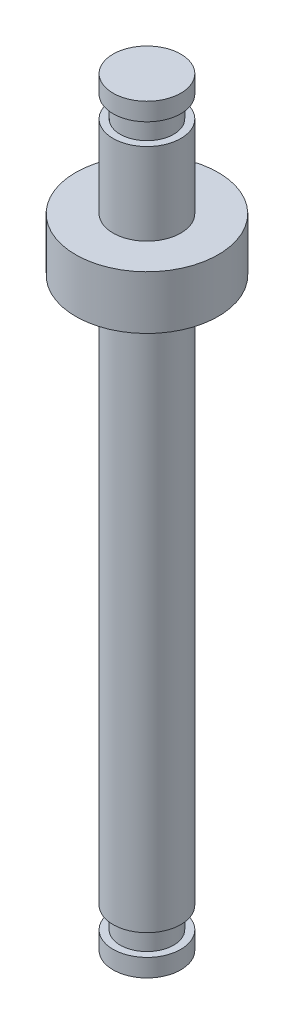
ISO-10303-21;
HEADER;
FILE_DESCRIPTION(('STEP AP214'),'2;1');
FILE_NAME('part.step','',(''),(''),'','','');
FILE_SCHEMA(('AUTOMOTIVE_DESIGN { 1 0 10303 214 1 1 1 1 }'));
ENDSEC;
DATA;
#1=APPLICATION_CONTEXT('core data for automotive mechanical design processes');
#2=APPLICATION_PROTOCOL_DEFINITION('international standard','automotive_design',2000,#1);
#3=PRODUCT_CONTEXT('',#1,'mechanical');
#4=PRODUCT('Part','Part','',(#3));
#5=PRODUCT_RELATED_PRODUCT_CATEGORY('part','',(#4));
#6=PRODUCT_DEFINITION_FORMATION('','',#4);
#7=PRODUCT_DEFINITION_CONTEXT('part definition',#1,'design');
#8=PRODUCT_DEFINITION('design','',#6,#7);
#9=PRODUCT_DEFINITION_SHAPE('','',#8);
#10=(LENGTH_UNIT() NAMED_UNIT(*) SI_UNIT(.MILLI.,.METRE.));
#11=(NAMED_UNIT(*) PLANE_ANGLE_UNIT() SI_UNIT($,.RADIAN.));
#12=(NAMED_UNIT(*) SI_UNIT($,.STERADIAN.) SOLID_ANGLE_UNIT());
#13=UNCERTAINTY_MEASURE_WITH_UNIT(LENGTH_MEASURE(1.E-05),#10,'distance_accuracy_value','');
#14=(GEOMETRIC_REPRESENTATION_CONTEXT(3) GLOBAL_UNCERTAINTY_ASSIGNED_CONTEXT((#13)) GLOBAL_UNIT_ASSIGNED_CONTEXT((#10,
#11,#12)) REPRESENTATION_CONTEXT('',''));
#15=CARTESIAN_POINT('',(0.,0.,0.));
#16=DIRECTION('',(0.,0.,1.));
#17=DIRECTION('',(1.,0.,0.));
#18=AXIS2_PLACEMENT_3D('',#15,#16,#17);
#19=CARTESIAN_POINT('',(0.,-35.3,0.));
#20=DIRECTION('',(0.,1.,0.));
#21=DIRECTION('',(-1.,0.,0.));
#22=AXIS2_PLACEMENT_3D('',#19,#20,#21);
#23=CYLINDRICAL_SURFACE('',#22,1.9);
#24=CARTESIAN_POINT('',(0.,-35.3,0.));
#25=DIRECTION('',(0.,1.,0.));
#26=DIRECTION('',(-1.,0.,0.));
#27=AXIS2_PLACEMENT_3D('',#24,#25,#26);
#28=CIRCLE('',#27,1.9);
#29=CARTESIAN_POINT('',(-1.9,-35.3,0.));
#30=VERTEX_POINT('',#29);
#31=EDGE_CURVE('E10',#30,#30,#28,.T.);
#32=ORIENTED_EDGE('',*,*,#31,.T.);
#33=EDGE_LOOP('',(#32));
#34=FACE_BOUND('',#33,.T.);
#35=CARTESIAN_POINT('',(0.,-34.3,0.));
#36=DIRECTION('',(0.,1.,0.));
#37=DIRECTION('',(-1.,0.,0.));
#38=AXIS2_PLACEMENT_3D('',#35,#36,#37);
#39=CIRCLE('',#38,1.9);
#40=CARTESIAN_POINT('',(-1.9,-34.3,0.));
#41=VERTEX_POINT('',#40);
#42=EDGE_CURVE('E96',#41,#41,#39,.T.);
#43=ORIENTED_EDGE('',*,*,#42,.F.);
#44=EDGE_LOOP('',(#43));
#45=FACE_BOUND('',#44,.T.);
#46=ADVANCED_FACE('F37',(#34,#45),#23,.T.);
#47=CARTESIAN_POINT('',(1.9,-35.3,0.));
#48=DIRECTION('',(0.,-1.,0.));
#49=DIRECTION('',(1.,0.,0.));
#50=AXIS2_PLACEMENT_3D('',#47,#48,#49);
#51=PLANE('',#50);
#52=ORIENTED_EDGE('',*,*,#31,.F.);
#53=EDGE_LOOP('',(#52));
#54=FACE_BOUND('',#53,.T.);
#55=ADVANCED_FACE('F105',(#54),#51,.T.);
#56=CARTESIAN_POINT('',(0.,7.3,0.));
#57=DIRECTION('',(0.,1.,0.));
#58=DIRECTION('',(-1.,0.,0.));
#59=AXIS2_PLACEMENT_3D('',#56,#57,#58);
#60=PLANE('',#59);
#61=CARTESIAN_POINT('',(0.,7.3,0.));
#62=DIRECTION('',(0.,1.,0.));
#63=DIRECTION('',(-1.,0.,0.));
#64=AXIS2_PLACEMENT_3D('',#61,#62,#63);
#65=CIRCLE('',#64,1.90000000000001);
#66=CARTESIAN_POINT('',(-1.90000000000001,7.3,0.));
#67=VERTEX_POINT('',#66);
#68=EDGE_CURVE('E44',#67,#67,#65,.T.);
#69=ORIENTED_EDGE('',*,*,#68,.T.);
#70=EDGE_LOOP('',(#69));
#71=FACE_BOUND('',#70,.T.);
#72=ADVANCED_FACE('F109',(#71),#60,.T.);
#73=CARTESIAN_POINT('',(0.,-35.3,0.));
#74=DIRECTION('',(0.,1.,0.));
#75=DIRECTION('',(-1.,0.,0.));
#76=AXIS2_PLACEMENT_3D('',#73,#74,#75);
#77=CYLINDRICAL_SURFACE('',#76,1.90000000000001);
#78=CARTESIAN_POINT('',(0.,6.3,0.));
#79=DIRECTION('',(0.,1.,0.));
#80=DIRECTION('',(-1.,0.,0.));
#81=AXIS2_PLACEMENT_3D('',#78,#79,#80);
#82=CIRCLE('',#81,1.90000000000001);
#83=CARTESIAN_POINT('',(-1.90000000000001,6.3,0.));
#84=VERTEX_POINT('',#83);
#85=EDGE_CURVE('E49',#84,#84,#82,.T.);
#86=ORIENTED_EDGE('',*,*,#85,.T.);
#87=EDGE_LOOP('',(#86));
#88=FACE_BOUND('',#87,.T.);
#89=ORIENTED_EDGE('',*,*,#68,.F.);
#90=EDGE_LOOP('',(#89));
#91=FACE_BOUND('',#90,.T.);
#92=ADVANCED_FACE('F114',(#88,#91),#77,.T.);
#93=CARTESIAN_POINT('',(1.9,6.3,0.));
#94=DIRECTION('',(0.,-1.,0.));
#95=DIRECTION('',(1.,0.,0.));
#96=AXIS2_PLACEMENT_3D('',#93,#94,#95);
#97=PLANE('',#96);
#98=CARTESIAN_POINT('',(0.,6.3,0.));
#99=DIRECTION('',(0.,1.,0.));
#100=DIRECTION('',(-1.,0.,0.));
#101=AXIS2_PLACEMENT_3D('',#98,#99,#100);
#102=CIRCLE('',#101,1.50000000000001);
#103=CARTESIAN_POINT('',(-1.50000000000001,6.3,0.));
#104=VERTEX_POINT('',#103);
#105=EDGE_CURVE('E54',#104,#104,#102,.T.);
#106=ORIENTED_EDGE('',*,*,#105,.T.);
#107=EDGE_LOOP('',(#106));
#108=FACE_BOUND('',#107,.T.);
#109=ORIENTED_EDGE('',*,*,#85,.F.);
#110=EDGE_LOOP('',(#109));
#111=FACE_BOUND('',#110,.T.);
#112=ADVANCED_FACE('F119',(#108,#111),#97,.T.);
#113=CARTESIAN_POINT('',(0.,-35.3,0.));
#114=DIRECTION('',(0.,1.,0.));
#115=DIRECTION('',(-1.,0.,0.));
#116=AXIS2_PLACEMENT_3D('',#113,#114,#115);
#117=CYLINDRICAL_SURFACE('',#116,1.50000000000001);
#118=CARTESIAN_POINT('',(0.,5.1,0.));
#119=DIRECTION('',(0.,1.,0.));
#120=DIRECTION('',(-1.,0.,0.));
#121=AXIS2_PLACEMENT_3D('',#118,#119,#120);
#122=CIRCLE('',#121,1.50000000000001);
#123=CARTESIAN_POINT('',(-1.50000000000001,5.1,0.));
#124=VERTEX_POINT('',#123);
#125=EDGE_CURVE('E60',#124,#124,#122,.T.);
#126=ORIENTED_EDGE('',*,*,#125,.T.);
#127=EDGE_LOOP('',(#126));
#128=FACE_BOUND('',#127,.T.);
#129=ORIENTED_EDGE('',*,*,#105,.F.);
#130=EDGE_LOOP('',(#129));
#131=FACE_BOUND('',#130,.T.);
#132=ADVANCED_FACE('F123',(#128,#131),#117,.T.);
#133=CARTESIAN_POINT('',(1.5,5.1,0.));
#134=DIRECTION('',(0.,1.,0.));
#135=DIRECTION('',(-1.,0.,0.));
#136=AXIS2_PLACEMENT_3D('',#133,#134,#135);
#137=PLANE('',#136);
#138=CARTESIAN_POINT('',(0.,5.1,0.));
#139=DIRECTION('',(0.,1.,0.));
#140=DIRECTION('',(-1.,0.,0.));
#141=AXIS2_PLACEMENT_3D('',#138,#139,#140);
#142=CIRCLE('',#141,1.90000000000001);
#143=CARTESIAN_POINT('',(-1.90000000000001,5.1,0.));
#144=VERTEX_POINT('',#143);
#145=EDGE_CURVE('E64',#144,#144,#142,.T.);
#146=ORIENTED_EDGE('',*,*,#145,.T.);
#147=EDGE_LOOP('',(#146));
#148=FACE_BOUND('',#147,.T.);
#149=ORIENTED_EDGE('',*,*,#125,.F.);
#150=EDGE_LOOP('',(#149));
#151=FACE_BOUND('',#150,.T.);
#152=ADVANCED_FACE('F127',(#148,#151),#137,.T.);
#153=CARTESIAN_POINT('',(0.,-35.3,0.));
#154=DIRECTION('',(0.,1.,0.));
#155=DIRECTION('',(-1.,0.,0.));
#156=AXIS2_PLACEMENT_3D('',#153,#154,#155);
#157=CYLINDRICAL_SURFACE('',#156,1.90000000000001);
#158=CARTESIAN_POINT('',(0.,0.5,0.));
#159=DIRECTION('',(0.,1.,0.));
#160=DIRECTION('',(-1.,0.,0.));
#161=AXIS2_PLACEMENT_3D('',#158,#159,#160);
#162=CIRCLE('',#161,1.90000000000001);
#163=CARTESIAN_POINT('',(-1.90000000000001,0.5,0.));
#164=VERTEX_POINT('',#163);
#165=EDGE_CURVE('E68',#164,#164,#162,.T.);
#166=ORIENTED_EDGE('',*,*,#165,.T.);
#167=EDGE_LOOP('',(#166));
#168=FACE_BOUND('',#167,.T.);
#169=ORIENTED_EDGE('',*,*,#145,.F.);
#170=EDGE_LOOP('',(#169));
#171=FACE_BOUND('',#170,.T.);
#172=ADVANCED_FACE('F131',(#168,#171),#157,.T.);
#173=CARTESIAN_POINT('',(1.9,0.5,0.));
#174=DIRECTION('',(0.,1.,0.));
#175=DIRECTION('',(-1.,0.,0.));
#176=AXIS2_PLACEMENT_3D('',#173,#174,#175);
#177=PLANE('',#176);
#178=CARTESIAN_POINT('',(0.,0.5,0.));
#179=DIRECTION('',(0.,1.,0.));
#180=DIRECTION('',(-1.,0.,0.));
#181=AXIS2_PLACEMENT_3D('',#178,#179,#180);
#182=CIRCLE('',#181,4.00000000000001);
#183=CARTESIAN_POINT('',(-4.00000000000001,0.5,0.));
#184=VERTEX_POINT('',#183);
#185=EDGE_CURVE('E72',#184,#184,#182,.T.);
#186=ORIENTED_EDGE('',*,*,#185,.T.);
#187=EDGE_LOOP('',(#186));
#188=FACE_BOUND('',#187,.T.);
#189=ORIENTED_EDGE('',*,*,#165,.F.);
#190=EDGE_LOOP('',(#189));
#191=FACE_BOUND('',#190,.T.);
#192=ADVANCED_FACE('F135',(#188,#191),#177,.T.);
#193=CARTESIAN_POINT('',(0.,-35.3,0.));
#194=DIRECTION('',(0.,1.,0.));
#195=DIRECTION('',(-1.,0.,0.));
#196=AXIS2_PLACEMENT_3D('',#193,#194,#195);
#197=CYLINDRICAL_SURFACE('',#196,4.00000000000001);
#198=CARTESIAN_POINT('',(0.,-2.5,0.));
#199=DIRECTION('',(0.,1.,0.));
#200=DIRECTION('',(-1.,0.,0.));
#201=AXIS2_PLACEMENT_3D('',#198,#199,#200);
#202=CIRCLE('',#201,4.00000000000001);
#203=CARTESIAN_POINT('',(-4.00000000000001,-2.5,0.));
#204=VERTEX_POINT('',#203);
#205=EDGE_CURVE('E76',#204,#204,#202,.T.);
#206=ORIENTED_EDGE('',*,*,#205,.T.);
#207=EDGE_LOOP('',(#206));
#208=FACE_BOUND('',#207,.T.);
#209=ORIENTED_EDGE('',*,*,#185,.F.);
#210=EDGE_LOOP('',(#209));
#211=FACE_BOUND('',#210,.T.);
#212=ADVANCED_FACE('F139',(#208,#211),#197,.T.);
#213=CARTESIAN_POINT('',(4.,-2.5,0.));
#214=DIRECTION('',(0.,-1.,0.));
#215=DIRECTION('',(1.,0.,0.));
#216=AXIS2_PLACEMENT_3D('',#213,#214,#215);
#217=PLANE('',#216);
#218=CARTESIAN_POINT('',(0.,-2.5,0.));
#219=DIRECTION('',(0.,1.,0.));
#220=DIRECTION('',(-1.,0.,0.));
#221=AXIS2_PLACEMENT_3D('',#218,#219,#220);
#222=CIRCLE('',#221,1.9);
#223=CARTESIAN_POINT('',(-1.90000000000001,-2.5,0.));
#224=VERTEX_POINT('',#223);
#225=EDGE_CURVE('E80',#224,#224,#222,.T.);
#226=ORIENTED_EDGE('',*,*,#225,.T.);
#227=EDGE_LOOP('',(#226));
#228=FACE_BOUND('',#227,.T.);
#229=ORIENTED_EDGE('',*,*,#205,.F.);
#230=EDGE_LOOP('',(#229));
#231=FACE_BOUND('',#230,.T.);
#232=ADVANCED_FACE('F143',(#228,#231),#217,.T.);
#233=CARTESIAN_POINT('',(0.,-35.3,0.));
#234=DIRECTION('',(0.,1.,0.));
#235=DIRECTION('',(-1.,0.,0.));
#236=AXIS2_PLACEMENT_3D('',#233,#234,#235);
#237=CYLINDRICAL_SURFACE('',#236,1.9);
#238=CARTESIAN_POINT('',(0.,-33.1,0.));
#239=DIRECTION('',(0.,1.,0.));
#240=DIRECTION('',(-1.,0.,0.));
#241=AXIS2_PLACEMENT_3D('',#238,#239,#240);
#242=CIRCLE('',#241,1.9);
#243=CARTESIAN_POINT('',(-1.90000000000001,-33.1,0.));
#244=VERTEX_POINT('',#243);
#245=EDGE_CURVE('E84',#244,#244,#242,.T.);
#246=ORIENTED_EDGE('',*,*,#245,.T.);
#247=EDGE_LOOP('',(#246));
#248=FACE_BOUND('',#247,.T.);
#249=ORIENTED_EDGE('',*,*,#225,.F.);
#250=EDGE_LOOP('',(#249));
#251=FACE_BOUND('',#250,.T.);
#252=ADVANCED_FACE('F147',(#248,#251),#237,.T.);
#253=CARTESIAN_POINT('',(1.9,-33.1,0.));
#254=DIRECTION('',(0.,-1.,0.));
#255=DIRECTION('',(1.,0.,0.));
#256=AXIS2_PLACEMENT_3D('',#253,#254,#255);
#257=PLANE('',#256);
#258=CARTESIAN_POINT('',(0.,-33.1,0.));
#259=DIRECTION('',(0.,1.,0.));
#260=DIRECTION('',(-1.,0.,0.));
#261=AXIS2_PLACEMENT_3D('',#258,#259,#260);
#262=CIRCLE('',#261,1.5);
#263=CARTESIAN_POINT('',(-1.50000000000001,-33.1,0.));
#264=VERTEX_POINT('',#263);
#265=EDGE_CURVE('E88',#264,#264,#262,.T.);
#266=ORIENTED_EDGE('',*,*,#265,.T.);
#267=EDGE_LOOP('',(#266));
#268=FACE_BOUND('',#267,.T.);
#269=ORIENTED_EDGE('',*,*,#245,.F.);
#270=EDGE_LOOP('',(#269));
#271=FACE_BOUND('',#270,.T.);
#272=ADVANCED_FACE('F151',(#268,#271),#257,.T.);
#273=CARTESIAN_POINT('',(0.,-35.3,0.));
#274=DIRECTION('',(0.,1.,0.));
#275=DIRECTION('',(-1.,0.,0.));
#276=AXIS2_PLACEMENT_3D('',#273,#274,#275);
#277=CYLINDRICAL_SURFACE('',#276,1.5);
#278=CARTESIAN_POINT('',(0.,-34.3,0.));
#279=DIRECTION('',(0.,1.,0.));
#280=DIRECTION('',(-1.,0.,0.));
#281=AXIS2_PLACEMENT_3D('',#278,#279,#280);
#282=CIRCLE('',#281,1.5);
#283=CARTESIAN_POINT('',(-1.5,-34.3,0.));
#284=VERTEX_POINT('',#283);
#285=EDGE_CURVE('E92',#284,#284,#282,.T.);
#286=ORIENTED_EDGE('',*,*,#285,.T.);
#287=EDGE_LOOP('',(#286));
#288=FACE_BOUND('',#287,.T.);
#289=ORIENTED_EDGE('',*,*,#265,.F.);
#290=EDGE_LOOP('',(#289));
#291=FACE_BOUND('',#290,.T.);
#292=ADVANCED_FACE('F155',(#288,#291),#277,.T.);
#293=CARTESIAN_POINT('',(1.5,-34.3,0.));
#294=DIRECTION('',(0.,1.,0.));
#295=DIRECTION('',(-1.,0.,0.));
#296=AXIS2_PLACEMENT_3D('',#293,#294,#295);
#297=PLANE('',#296);
#298=ORIENTED_EDGE('',*,*,#42,.T.);
#299=EDGE_LOOP('',(#298));
#300=FACE_BOUND('',#299,.T.);
#301=ORIENTED_EDGE('',*,*,#285,.F.);
#302=EDGE_LOOP('',(#301));
#303=FACE_BOUND('',#302,.T.);
#304=ADVANCED_FACE('F101',(#300,#303),#297,.T.);
#305=CLOSED_SHELL('',(#46,#55,#72,#92,#112,#132,#152,#172,#192,#212,#232,#252,#272,#292,#304));
#306=MANIFOLD_SOLID_BREP('B2',#305);
#307=ADVANCED_BREP_SHAPE_REPRESENTATION('',(#18,#306),#14);
#308=SHAPE_DEFINITION_REPRESENTATION(#9,#307);
ENDSEC;
END-ISO-10303-21;
